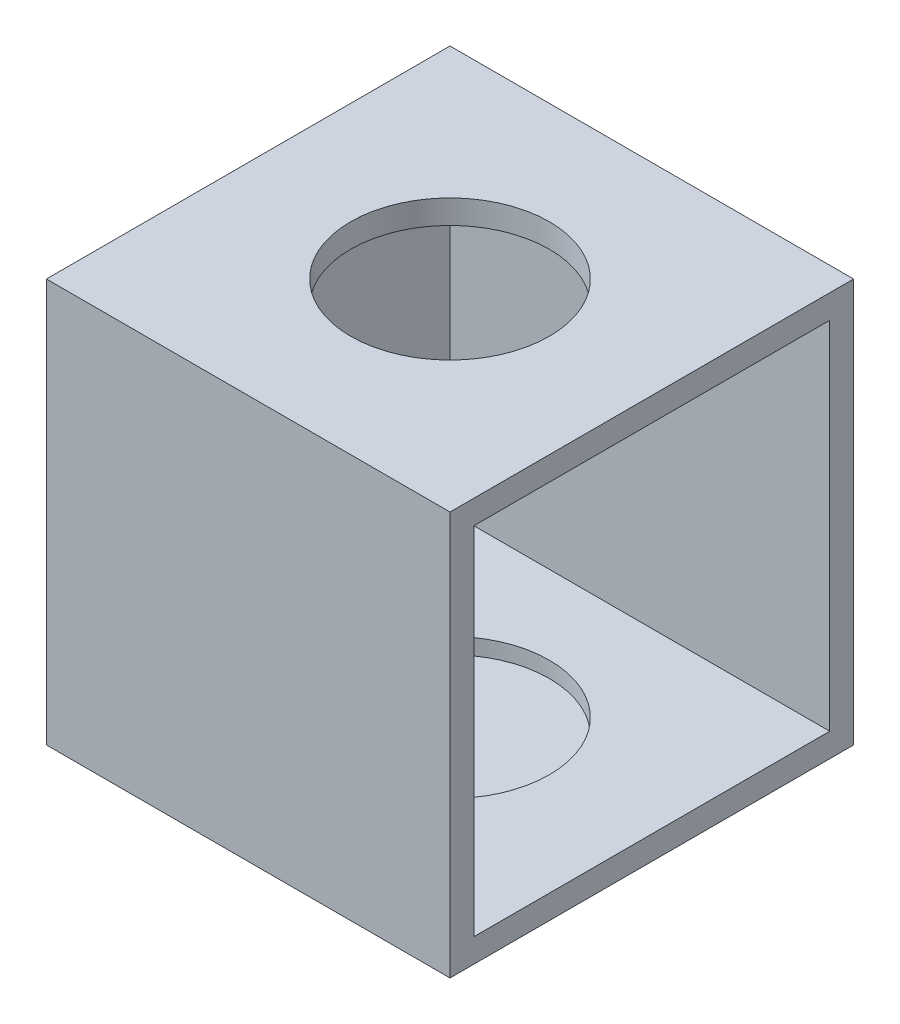
ISO-10303-21;
HEADER;
FILE_DESCRIPTION(('STEP AP214'),'2;1');
FILE_NAME('part.step','',(''),(''),'','','');
FILE_SCHEMA(('AUTOMOTIVE_DESIGN { 1 0 10303 214 1 1 1 1 }'));
ENDSEC;
DATA;
#1=APPLICATION_CONTEXT('core data for automotive mechanical design processes');
#2=APPLICATION_PROTOCOL_DEFINITION('international standard','automotive_design',2000,#1);
#3=PRODUCT_CONTEXT('',#1,'mechanical');
#4=PRODUCT('Part','Part','',(#3));
#5=PRODUCT_RELATED_PRODUCT_CATEGORY('part','',(#4));
#6=PRODUCT_DEFINITION_FORMATION('','',#4);
#7=PRODUCT_DEFINITION_CONTEXT('part definition',#1,'design');
#8=PRODUCT_DEFINITION('design','',#6,#7);
#9=PRODUCT_DEFINITION_SHAPE('','',#8);
#10=(LENGTH_UNIT() NAMED_UNIT(*) SI_UNIT(.MILLI.,.METRE.));
#11=(NAMED_UNIT(*) PLANE_ANGLE_UNIT() SI_UNIT($,.RADIAN.));
#12=(NAMED_UNIT(*) SI_UNIT($,.STERADIAN.) SOLID_ANGLE_UNIT());
#13=UNCERTAINTY_MEASURE_WITH_UNIT(LENGTH_MEASURE(1.E-05),#10,'distance_accuracy_value','');
#14=(GEOMETRIC_REPRESENTATION_CONTEXT(3) GLOBAL_UNCERTAINTY_ASSIGNED_CONTEXT((#13)) GLOBAL_UNIT_ASSIGNED_CONTEXT((#10,
#11,#12)) REPRESENTATION_CONTEXT('',''));
#15=CARTESIAN_POINT('',(0.,0.,0.));
#16=DIRECTION('',(0.,0.,1.));
#17=DIRECTION('',(1.,0.,0.));
#18=AXIS2_PLACEMENT_3D('',#15,#16,#17);
#19=CARTESIAN_POINT('',(25.4,50.8,-25.4));
#20=DIRECTION('',(-1.,0.,0.));
#21=DIRECTION('',(0.,0.,1.));
#22=AXIS2_PLACEMENT_3D('',#19,#20,#21);
#23=PLANE('',#22);
#24=DIRECTION('',(0.,0.,-1.));
#25=VECTOR('',#24,1.);
#26=CARTESIAN_POINT('',(25.4,0.,-25.4));
#27=LINE('',#26,#25);
#28=CARTESIAN_POINT('',(25.4,0.,25.4));
#29=VERTEX_POINT('',#28);
#30=CARTESIAN_POINT('',(25.4,0.,-25.4));
#31=VERTEX_POINT('',#30);
#32=EDGE_CURVE('E229',#29,#31,#27,.T.);
#33=ORIENTED_EDGE('',*,*,#32,.T.);
#34=DIRECTION('',(0.,-1.,0.));
#35=VECTOR('',#34,1.);
#36=CARTESIAN_POINT('',(25.4,50.8,-25.4));
#37=LINE('',#36,#35);
#38=CARTESIAN_POINT('',(25.4,50.8,-25.4));
#39=VERTEX_POINT('',#38);
#40=EDGE_CURVE('E11',#39,#31,#37,.T.);
#41=ORIENTED_EDGE('',*,*,#40,.F.);
#42=DIRECTION('',(0.,0.,-1.));
#43=VECTOR('',#42,1.);
#44=CARTESIAN_POINT('',(25.4,50.8,-25.4));
#45=LINE('',#44,#43);
#46=CARTESIAN_POINT('',(25.4,50.8,25.4));
#47=VERTEX_POINT('',#46);
#48=EDGE_CURVE('E239',#47,#39,#45,.T.);
#49=ORIENTED_EDGE('',*,*,#48,.F.);
#50=DIRECTION('',(0.,-1.,0.));
#51=VECTOR('',#50,1.);
#52=CARTESIAN_POINT('',(25.4,50.8,25.4));
#53=LINE('',#52,#51);
#54=EDGE_CURVE('E253',#47,#29,#53,.T.);
#55=ORIENTED_EDGE('',*,*,#54,.T.);
#56=EDGE_LOOP('',(#33,#41,#49,#55));
#57=FACE_BOUND('',#56,.T.);
#58=DIRECTION('',(0.,0.,-1.));
#59=VECTOR('',#58,1.);
#60=CARTESIAN_POINT('',(25.4,3.,-25.4));
#61=LINE('',#60,#59);
#62=CARTESIAN_POINT('',(25.4,3.,22.4));
#63=VERTEX_POINT('',#62);
#64=CARTESIAN_POINT('',(25.4,3.,-22.4));
#65=VERTEX_POINT('',#64);
#66=EDGE_CURVE('E199',#63,#65,#61,.T.);
#67=ORIENTED_EDGE('',*,*,#66,.F.);
#68=DIRECTION('',(0.,-1.,0.));
#69=VECTOR('',#68,1.);
#70=CARTESIAN_POINT('',(25.4,50.8,22.4));
#71=LINE('',#70,#69);
#72=CARTESIAN_POINT('',(25.4,47.8,22.4));
#73=VERTEX_POINT('',#72);
#74=EDGE_CURVE('E217',#73,#63,#71,.T.);
#75=ORIENTED_EDGE('',*,*,#74,.F.);
#76=DIRECTION('',(0.,0.,-1.));
#77=VECTOR('',#76,1.);
#78=CARTESIAN_POINT('',(25.4,47.8,-25.4));
#79=LINE('',#78,#77);
#80=CARTESIAN_POINT('',(25.4,47.8,-22.4));
#81=VERTEX_POINT('',#80);
#82=EDGE_CURVE('E210',#73,#81,#79,.T.);
#83=ORIENTED_EDGE('',*,*,#82,.T.);
#84=DIRECTION('',(0.,-1.,0.));
#85=VECTOR('',#84,1.);
#86=CARTESIAN_POINT('',(25.4,50.8,-22.4));
#87=LINE('',#86,#85);
#88=EDGE_CURVE('E204',#81,#65,#87,.T.);
#89=ORIENTED_EDGE('',*,*,#88,.T.);
#90=EDGE_LOOP('',(#67,#75,#83,#89));
#91=FACE_BOUND('',#90,.T.);
#92=ADVANCED_FACE('F39',(#57,#91),#23,.F.);
#93=CARTESIAN_POINT('',(-25.4,50.8,-25.4));
#94=DIRECTION('',(0.,0.,1.));
#95=DIRECTION('',(1.,0.,0.));
#96=AXIS2_PLACEMENT_3D('',#93,#94,#95);
#97=PLANE('',#96);
#98=DIRECTION('',(-1.,0.,0.));
#99=VECTOR('',#98,1.);
#100=CARTESIAN_POINT('',(-25.4,0.,-25.4));
#101=LINE('',#100,#99);
#102=CARTESIAN_POINT('',(-25.4,0.,-25.4));
#103=VERTEX_POINT('',#102);
#104=EDGE_CURVE('E257',#31,#103,#101,.T.);
#105=ORIENTED_EDGE('',*,*,#104,.T.);
#106=DIRECTION('',(0.,-1.,0.));
#107=VECTOR('',#106,1.);
#108=CARTESIAN_POINT('',(-25.4,50.8,-25.4));
#109=LINE('',#108,#107);
#110=CARTESIAN_POINT('',(-25.4,50.8,-25.4));
#111=VERTEX_POINT('',#110);
#112=EDGE_CURVE('E48',#111,#103,#109,.T.);
#113=ORIENTED_EDGE('',*,*,#112,.F.);
#114=DIRECTION('',(-1.,0.,0.));
#115=VECTOR('',#114,1.);
#116=CARTESIAN_POINT('',(-25.4,50.8,-25.4));
#117=LINE('',#116,#115);
#118=EDGE_CURVE('E243',#39,#111,#117,.T.);
#119=ORIENTED_EDGE('',*,*,#118,.F.);
#120=ORIENTED_EDGE('',*,*,#40,.T.);
#121=EDGE_LOOP('',(#105,#113,#119,#120));
#122=FACE_BOUND('',#121,.T.);
#123=ADVANCED_FACE('F302',(#122),#97,.F.);
#124=CARTESIAN_POINT('',(-25.4,50.8,-25.4));
#125=DIRECTION('',(1.,0.,0.));
#126=DIRECTION('',(0.,0.,-1.));
#127=AXIS2_PLACEMENT_3D('',#124,#125,#126);
#128=PLANE('',#127);
#129=DIRECTION('',(0.,0.,-1.));
#130=VECTOR('',#129,1.);
#131=CARTESIAN_POINT('',(-25.4,40.442725035698,-25.4));
#132=LINE('',#131,#130);
#133=CARTESIAN_POINT('',(-25.4,40.442725035698,12.5));
#134=VERTEX_POINT('',#133);
#135=CARTESIAN_POINT('',(-25.4,40.442725035698,-12.5));
#136=VERTEX_POINT('',#135);
#137=EDGE_CURVE('E170',#134,#136,#132,.T.);
#138=ORIENTED_EDGE('',*,*,#137,.T.);
#139=DIRECTION('',(0.,1.,0.));
#140=VECTOR('',#139,1.);
#141=CARTESIAN_POINT('',(-25.4,50.8,-12.5));
#142=LINE('',#141,#140);
#143=CARTESIAN_POINT('',(-25.4,46.442725035698,-12.5));
#144=VERTEX_POINT('',#143);
#145=EDGE_CURVE('E174',#136,#144,#142,.T.);
#146=ORIENTED_EDGE('',*,*,#145,.T.);
#147=DIRECTION('',(0.,0.,1.));
#148=VECTOR('',#147,1.);
#149=CARTESIAN_POINT('',(-25.4,46.442725035698,-25.4));
#150=LINE('',#149,#148);
#151=CARTESIAN_POINT('',(-25.4,46.442725035698,12.5));
#152=VERTEX_POINT('',#151);
#153=EDGE_CURVE('E161',#144,#152,#150,.T.);
#154=ORIENTED_EDGE('',*,*,#153,.T.);
#155=DIRECTION('',(0.,-1.,0.));
#156=VECTOR('',#155,1.);
#157=CARTESIAN_POINT('',(-25.4,50.8,12.5));
#158=LINE('',#157,#156);
#159=EDGE_CURVE('E136',#152,#134,#158,.T.);
#160=ORIENTED_EDGE('',*,*,#159,.T.);
#161=EDGE_LOOP('',(#138,#146,#154,#160));
#162=FACE_BOUND('',#161,.T.);
#163=CARTESIAN_POINT('',(-25.4,25.4,0.));
#164=DIRECTION('',(-1.,0.,0.));
#165=DIRECTION('',(0.,0.,1.));
#166=AXIS2_PLACEMENT_3D('',#163,#164,#165);
#167=CIRCLE('',#166,3.175);
#168=CARTESIAN_POINT('',(-25.4,25.4,3.175));
#169=VERTEX_POINT('',#168);
#170=EDGE_CURVE('E190',#169,#169,#167,.T.);
#171=ORIENTED_EDGE('',*,*,#170,.F.);
#172=EDGE_LOOP('',(#171));
#173=FACE_BOUND('',#172,.T.);
#174=DIRECTION('',(0.,0.,1.));
#175=VECTOR('',#174,1.);
#176=CARTESIAN_POINT('',(-25.4,0.,-25.4));
#177=LINE('',#176,#175);
#178=CARTESIAN_POINT('',(-25.4,0.,25.4));
#179=VERTEX_POINT('',#178);
#180=EDGE_CURVE('E260',#103,#179,#177,.T.);
#181=ORIENTED_EDGE('',*,*,#180,.T.);
#182=DIRECTION('',(0.,-1.,0.));
#183=VECTOR('',#182,1.);
#184=CARTESIAN_POINT('',(-25.4,50.8,25.4));
#185=LINE('',#184,#183);
#186=CARTESIAN_POINT('',(-25.4,50.8,25.4));
#187=VERTEX_POINT('',#186);
#188=EDGE_CURVE('E268',#187,#179,#185,.T.);
#189=ORIENTED_EDGE('',*,*,#188,.F.);
#190=DIRECTION('',(0.,0.,1.));
#191=VECTOR('',#190,1.);
#192=CARTESIAN_POINT('',(-25.4,50.8,-25.4));
#193=LINE('',#192,#191);
#194=EDGE_CURVE('E247',#111,#187,#193,.T.);
#195=ORIENTED_EDGE('',*,*,#194,.F.);
#196=ORIENTED_EDGE('',*,*,#112,.T.);
#197=EDGE_LOOP('',(#181,#189,#195,#196));
#198=FACE_BOUND('',#197,.T.);
#199=ADVANCED_FACE('F307',(#162,#173,#198),#128,.F.);
#200=CARTESIAN_POINT('',(-25.4,50.8,25.4));
#201=DIRECTION('',(0.,0.,-1.));
#202=DIRECTION('',(-1.,0.,0.));
#203=AXIS2_PLACEMENT_3D('',#200,#201,#202);
#204=PLANE('',#203);
#205=DIRECTION('',(1.,0.,0.));
#206=VECTOR('',#205,1.);
#207=CARTESIAN_POINT('',(-25.4,0.,25.4));
#208=LINE('',#207,#206);
#209=EDGE_CURVE('E244',#179,#29,#208,.T.);
#210=ORIENTED_EDGE('',*,*,#209,.T.);
#211=ORIENTED_EDGE('',*,*,#54,.F.);
#212=DIRECTION('',(1.,0.,0.));
#213=VECTOR('',#212,1.);
#214=CARTESIAN_POINT('',(-25.4,50.8,25.4));
#215=LINE('',#214,#213);
#216=EDGE_CURVE('E250',#187,#47,#215,.T.);
#217=ORIENTED_EDGE('',*,*,#216,.F.);
#218=ORIENTED_EDGE('',*,*,#188,.T.);
#219=EDGE_LOOP('',(#210,#211,#217,#218));
#220=FACE_BOUND('',#219,.T.);
#221=ADVANCED_FACE('F324',(#220),#204,.F.);
#222=CARTESIAN_POINT('',(0.,50.8,0.));
#223=DIRECTION('',(0.,1.,0.));
#224=DIRECTION('',(0.,0.,1.));
#225=AXIS2_PLACEMENT_3D('',#222,#223,#224);
#226=PLANE('',#225);
#227=CARTESIAN_POINT('',(0.,50.8,0.));
#228=DIRECTION('',(0.,1.,0.));
#229=DIRECTION('',(0.,0.,1.));
#230=AXIS2_PLACEMENT_3D('',#227,#228,#229);
#231=CIRCLE('',#230,12.5);
#232=CARTESIAN_POINT('',(0.,50.8,12.5));
#233=VERTEX_POINT('',#232);
#234=EDGE_CURVE('E178',#233,#233,#231,.T.);
#235=ORIENTED_EDGE('',*,*,#234,.F.);
#236=EDGE_LOOP('',(#235));
#237=FACE_BOUND('',#236,.T.);
#238=ORIENTED_EDGE('',*,*,#48,.T.);
#239=ORIENTED_EDGE('',*,*,#118,.T.);
#240=ORIENTED_EDGE('',*,*,#194,.T.);
#241=ORIENTED_EDGE('',*,*,#216,.T.);
#242=EDGE_LOOP('',(#238,#239,#240,#241));
#243=FACE_BOUND('',#242,.T.);
#244=ADVANCED_FACE('F320',(#237,#243),#226,.T.);
#245=CARTESIAN_POINT('',(0.,0.,0.));
#246=DIRECTION('',(0.,1.,0.));
#247=DIRECTION('',(0.,0.,1.));
#248=AXIS2_PLACEMENT_3D('',#245,#246,#247);
#249=PLANE('',#248);
#250=ORIENTED_EDGE('',*,*,#32,.F.);
#251=ORIENTED_EDGE('',*,*,#209,.F.);
#252=ORIENTED_EDGE('',*,*,#180,.F.);
#253=ORIENTED_EDGE('',*,*,#104,.F.);
#254=EDGE_LOOP('',(#250,#251,#252,#253));
#255=FACE_BOUND('',#254,.T.);
#256=ADVANCED_FACE('F315',(#255),#249,.F.);
#257=CARTESIAN_POINT('',(-25.4,50.8,-22.4));
#258=DIRECTION('',(0.,0.,1.));
#259=DIRECTION('',(1.,0.,0.));
#260=AXIS2_PLACEMENT_3D('',#257,#258,#259);
#261=PLANE('',#260);
#262=DIRECTION('',(-1.,0.,0.));
#263=VECTOR('',#262,1.);
#264=CARTESIAN_POINT('',(-25.4,3.,-22.4));
#265=LINE('',#264,#263);
#266=CARTESIAN_POINT('',(-22.4,3.,-22.4));
#267=VERTEX_POINT('',#266);
#268=EDGE_CURVE('E195',#65,#267,#265,.T.);
#269=ORIENTED_EDGE('',*,*,#268,.F.);
#270=ORIENTED_EDGE('',*,*,#88,.F.);
#271=DIRECTION('',(-1.,0.,0.));
#272=VECTOR('',#271,1.);
#273=CARTESIAN_POINT('',(-25.4,47.8,-22.4));
#274=LINE('',#273,#272);
#275=CARTESIAN_POINT('',(-22.4,47.8,-22.4));
#276=VERTEX_POINT('',#275);
#277=EDGE_CURVE('E206',#81,#276,#274,.T.);
#278=ORIENTED_EDGE('',*,*,#277,.T.);
#279=DIRECTION('',(0.,-1.,0.));
#280=VECTOR('',#279,1.);
#281=CARTESIAN_POINT('',(-22.4,50.8,-22.4));
#282=LINE('',#281,#280);
#283=EDGE_CURVE('E200',#276,#267,#282,.T.);
#284=ORIENTED_EDGE('',*,*,#283,.T.);
#285=EDGE_LOOP('',(#269,#270,#278,#284));
#286=FACE_BOUND('',#285,.T.);
#287=ADVANCED_FACE('F283',(#286),#261,.T.);
#288=CARTESIAN_POINT('',(-22.4,50.8,-25.4));
#289=DIRECTION('',(1.,0.,0.));
#290=DIRECTION('',(0.,0.,-1.));
#291=AXIS2_PLACEMENT_3D('',#288,#289,#290);
#292=PLANE('',#291);
#293=DIRECTION('',(0.,1.,0.));
#294=VECTOR('',#293,1.);
#295=CARTESIAN_POINT('',(-22.4,46.442725035698,-12.5));
#296=LINE('',#295,#294);
#297=CARTESIAN_POINT('',(-22.4,40.442725035698,-12.5));
#298=VERTEX_POINT('',#297);
#299=CARTESIAN_POINT('',(-22.4,46.442725035698,-12.5));
#300=VERTEX_POINT('',#299);
#301=EDGE_CURVE('E64',#298,#300,#296,.T.);
#302=ORIENTED_EDGE('',*,*,#301,.F.);
#303=DIRECTION('',(0.,0.,-1.));
#304=VECTOR('',#303,1.);
#305=CARTESIAN_POINT('',(-22.4,40.442725035698,12.5));
#306=LINE('',#305,#304);
#307=CARTESIAN_POINT('',(-22.4,40.442725035698,12.5));
#308=VERTEX_POINT('',#307);
#309=EDGE_CURVE('E151',#308,#298,#306,.T.);
#310=ORIENTED_EDGE('',*,*,#309,.F.);
#311=DIRECTION('',(0.,-1.,0.));
#312=VECTOR('',#311,1.);
#313=CARTESIAN_POINT('',(-22.4,46.442725035698,12.5));
#314=LINE('',#313,#312);
#315=CARTESIAN_POINT('',(-22.4,46.442725035698,12.5));
#316=VERTEX_POINT('',#315);
#317=EDGE_CURVE('E133',#316,#308,#314,.T.);
#318=ORIENTED_EDGE('',*,*,#317,.F.);
#319=DIRECTION('',(0.,0.,1.));
#320=VECTOR('',#319,1.);
#321=CARTESIAN_POINT('',(-22.4,46.442725035698,12.5));
#322=LINE('',#321,#320);
#323=EDGE_CURVE('E143',#300,#316,#322,.T.);
#324=ORIENTED_EDGE('',*,*,#323,.F.);
#325=EDGE_LOOP('',(#302,#310,#318,#324));
#326=FACE_BOUND('',#325,.T.);
#327=CARTESIAN_POINT('',(-22.4,25.4,0.));
#328=DIRECTION('',(1.,0.,0.));
#329=DIRECTION('',(0.,0.,-1.));
#330=AXIS2_PLACEMENT_3D('',#327,#328,#329);
#331=CIRCLE('',#330,3.175);
#332=CARTESIAN_POINT('',(-22.4,25.4,-3.175));
#333=VERTEX_POINT('',#332);
#334=EDGE_CURVE('E194',#333,#333,#331,.T.);
#335=ORIENTED_EDGE('',*,*,#334,.F.);
#336=EDGE_LOOP('',(#335));
#337=FACE_BOUND('',#336,.T.);
#338=DIRECTION('',(0.,0.,1.));
#339=VECTOR('',#338,1.);
#340=CARTESIAN_POINT('',(-22.4,3.,-25.4));
#341=LINE('',#340,#339);
#342=CARTESIAN_POINT('',(-22.4,3.,22.4));
#343=VERTEX_POINT('',#342);
#344=EDGE_CURVE('E198',#267,#343,#341,.T.);
#345=ORIENTED_EDGE('',*,*,#344,.F.);
#346=ORIENTED_EDGE('',*,*,#283,.F.);
#347=DIRECTION('',(0.,0.,1.));
#348=VECTOR('',#347,1.);
#349=CARTESIAN_POINT('',(-22.4,47.8,-25.4));
#350=LINE('',#349,#348);
#351=CARTESIAN_POINT('',(-22.4,47.8,22.4));
#352=VERTEX_POINT('',#351);
#353=EDGE_CURVE('E209',#276,#352,#350,.T.);
#354=ORIENTED_EDGE('',*,*,#353,.T.);
#355=DIRECTION('',(0.,-1.,0.));
#356=VECTOR('',#355,1.);
#357=CARTESIAN_POINT('',(-22.4,50.8,22.4));
#358=LINE('',#357,#356);
#359=EDGE_CURVE('E205',#352,#343,#358,.T.);
#360=ORIENTED_EDGE('',*,*,#359,.T.);
#361=EDGE_LOOP('',(#345,#346,#354,#360));
#362=FACE_BOUND('',#361,.T.);
#363=ADVANCED_FACE('F148',(#326,#337,#362),#292,.T.);
#364=CARTESIAN_POINT('',(-25.4,50.8,22.4));
#365=DIRECTION('',(0.,0.,-1.));
#366=DIRECTION('',(-1.,0.,0.));
#367=AXIS2_PLACEMENT_3D('',#364,#365,#366);
#368=PLANE('',#367);
#369=DIRECTION('',(1.,0.,0.));
#370=VECTOR('',#369,1.);
#371=CARTESIAN_POINT('',(-25.4,3.,22.4));
#372=LINE('',#371,#370);
#373=EDGE_CURVE('E213',#343,#63,#372,.T.);
#374=ORIENTED_EDGE('',*,*,#373,.F.);
#375=ORIENTED_EDGE('',*,*,#359,.F.);
#376=DIRECTION('',(1.,0.,0.));
#377=VECTOR('',#376,1.);
#378=CARTESIAN_POINT('',(-25.4,47.8,22.4));
#379=LINE('',#378,#377);
#380=EDGE_CURVE('E220',#352,#73,#379,.T.);
#381=ORIENTED_EDGE('',*,*,#380,.T.);
#382=ORIENTED_EDGE('',*,*,#74,.T.);
#383=EDGE_LOOP('',(#374,#375,#381,#382));
#384=FACE_BOUND('',#383,.T.);
#385=ADVANCED_FACE('F282',(#384),#368,.T.);
#386=CARTESIAN_POINT('',(0.,47.8,0.));
#387=DIRECTION('',(0.,1.,0.));
#388=DIRECTION('',(0.,0.,1.));
#389=AXIS2_PLACEMENT_3D('',#386,#387,#388);
#390=PLANE('',#389);
#391=CARTESIAN_POINT('',(0.,47.8,0.));
#392=DIRECTION('',(0.,1.,0.));
#393=DIRECTION('',(0.,0.,1.));
#394=AXIS2_PLACEMENT_3D('',#391,#392,#393);
#395=CIRCLE('',#394,12.5);
#396=CARTESIAN_POINT('',(0.,47.8,12.5));
#397=VERTEX_POINT('',#396);
#398=EDGE_CURVE('E186',#397,#397,#395,.T.);
#399=ORIENTED_EDGE('',*,*,#398,.T.);
#400=EDGE_LOOP('',(#399));
#401=FACE_BOUND('',#400,.T.);
#402=ORIENTED_EDGE('',*,*,#82,.F.);
#403=ORIENTED_EDGE('',*,*,#380,.F.);
#404=ORIENTED_EDGE('',*,*,#353,.F.);
#405=ORIENTED_EDGE('',*,*,#277,.F.);
#406=EDGE_LOOP('',(#402,#403,#404,#405));
#407=FACE_BOUND('',#406,.T.);
#408=ADVANCED_FACE('F296',(#401,#407),#390,.F.);
#409=CARTESIAN_POINT('',(0.,3.,0.));
#410=DIRECTION('',(0.,1.,0.));
#411=DIRECTION('',(0.,0.,1.));
#412=AXIS2_PLACEMENT_3D('',#409,#410,#411);
#413=PLANE('',#412);
#414=CARTESIAN_POINT('',(0.,3.,0.));
#415=DIRECTION('',(0.,1.,0.));
#416=DIRECTION('',(0.,0.,1.));
#417=AXIS2_PLACEMENT_3D('',#414,#415,#416);
#418=CIRCLE('',#417,12.5);
#419=CARTESIAN_POINT('',(0.,3.,12.5));
#420=VERTEX_POINT('',#419);
#421=EDGE_CURVE('E42',#420,#420,#418,.T.);
#422=ORIENTED_EDGE('',*,*,#421,.F.);
#423=EDGE_LOOP('',(#422));
#424=FACE_BOUND('',#423,.T.);
#425=ORIENTED_EDGE('',*,*,#66,.T.);
#426=ORIENTED_EDGE('',*,*,#268,.T.);
#427=ORIENTED_EDGE('',*,*,#344,.T.);
#428=ORIENTED_EDGE('',*,*,#373,.T.);
#429=EDGE_LOOP('',(#425,#426,#427,#428));
#430=FACE_BOUND('',#429,.T.);
#431=ADVANCED_FACE('F291',(#424,#430),#413,.T.);
#432=CARTESIAN_POINT('',(25.4,25.4,0.));
#433=DIRECTION('',(-1.,0.,0.));
#434=DIRECTION('',(0.,0.,1.));
#435=AXIS2_PLACEMENT_3D('',#432,#433,#434);
#436=CYLINDRICAL_SURFACE('',#435,3.175);
#437=ORIENTED_EDGE('',*,*,#334,.T.);
#438=EDGE_LOOP('',(#437));
#439=FACE_BOUND('',#438,.T.);
#440=ORIENTED_EDGE('',*,*,#170,.T.);
#441=EDGE_LOOP('',(#440));
#442=FACE_BOUND('',#441,.T.);
#443=ADVANCED_FACE('F278',(#439,#442),#436,.F.);
#444=CARTESIAN_POINT('',(0.,1.,0.));
#445=DIRECTION('',(0.,1.,0.));
#446=DIRECTION('',(0.,0.,1.));
#447=AXIS2_PLACEMENT_3D('',#444,#445,#446);
#448=PLANE('',#447);
#449=CARTESIAN_POINT('',(0.,1.,0.));
#450=DIRECTION('',(0.,1.,0.));
#451=DIRECTION('',(0.,0.,1.));
#452=AXIS2_PLACEMENT_3D('',#449,#450,#451);
#453=CIRCLE('',#452,12.5);
#454=CARTESIAN_POINT('',(0.,1.,12.5));
#455=VERTEX_POINT('',#454);
#456=EDGE_CURVE('E179',#455,#455,#453,.T.);
#457=ORIENTED_EDGE('',*,*,#456,.T.);
#458=EDGE_LOOP('',(#457));
#459=FACE_BOUND('',#458,.T.);
#460=ADVANCED_FACE('F352',(#459),#448,.T.);
#461=CARTESIAN_POINT('',(0.,1.,0.));
#462=DIRECTION('',(0.,1.,0.));
#463=DIRECTION('',(0.,0.,1.));
#464=AXIS2_PLACEMENT_3D('',#461,#462,#463);
#465=CYLINDRICAL_SURFACE('',#464,12.5);
#466=ORIENTED_EDGE('',*,*,#421,.T.);
#467=EDGE_LOOP('',(#466));
#468=FACE_BOUND('',#467,.T.);
#469=ORIENTED_EDGE('',*,*,#456,.F.);
#470=EDGE_LOOP('',(#469));
#471=FACE_BOUND('',#470,.T.);
#472=ADVANCED_FACE('F353',(#468,#471),#465,.F.);
#473=ORIENTED_EDGE('',*,*,#234,.T.);
#474=EDGE_LOOP('',(#473));
#475=FACE_BOUND('',#474,.T.);
#476=ORIENTED_EDGE('',*,*,#398,.F.);
#477=EDGE_LOOP('',(#476));
#478=FACE_BOUND('',#477,.T.);
#479=ADVANCED_FACE('F356',(#475,#478),#465,.F.);
#480=CARTESIAN_POINT('',(-72.2,46.442725035698,-12.5));
#481=DIRECTION('',(0.,0.,-1.));
#482=DIRECTION('',(-1.,0.,0.));
#483=AXIS2_PLACEMENT_3D('',#480,#481,#482);
#484=PLANE('',#483);
#485=DIRECTION('',(1.,0.,0.));
#486=VECTOR('',#485,1.);
#487=CARTESIAN_POINT('',(-72.2,40.442725035698,-12.5));
#488=LINE('',#487,#486);
#489=EDGE_CURVE('E158',#136,#298,#488,.T.);
#490=ORIENTED_EDGE('',*,*,#489,.T.);
#491=ORIENTED_EDGE('',*,*,#301,.T.);
#492=DIRECTION('',(1.,0.,0.));
#493=VECTOR('',#492,1.);
#494=CARTESIAN_POINT('',(-72.2,46.442725035698,-12.5));
#495=LINE('',#494,#493);
#496=EDGE_CURVE('E140',#144,#300,#495,.T.);
#497=ORIENTED_EDGE('',*,*,#496,.F.);
#498=ORIENTED_EDGE('',*,*,#145,.F.);
#499=EDGE_LOOP('',(#490,#491,#497,#498));
#500=FACE_BOUND('',#499,.T.);
#501=ADVANCED_FACE('F361',(#500),#484,.F.);
#502=CARTESIAN_POINT('',(-72.2,40.442725035698,12.5));
#503=DIRECTION('',(0.,-1.,0.));
#504=DIRECTION('',(0.,0.,-1.));
#505=AXIS2_PLACEMENT_3D('',#502,#503,#504);
#506=PLANE('',#505);
#507=DIRECTION('',(1.,0.,0.));
#508=VECTOR('',#507,1.);
#509=CARTESIAN_POINT('',(-72.2,40.442725035698,12.5));
#510=LINE('',#509,#508);
#511=EDGE_CURVE('E139',#134,#308,#510,.T.);
#512=ORIENTED_EDGE('',*,*,#511,.T.);
#513=ORIENTED_EDGE('',*,*,#309,.T.);
#514=ORIENTED_EDGE('',*,*,#489,.F.);
#515=ORIENTED_EDGE('',*,*,#137,.F.);
#516=EDGE_LOOP('',(#512,#513,#514,#515));
#517=FACE_BOUND('',#516,.T.);
#518=ADVANCED_FACE('F364',(#517),#506,.F.);
#519=CARTESIAN_POINT('',(-72.2,46.442725035698,12.5));
#520=DIRECTION('',(0.,0.,1.));
#521=DIRECTION('',(1.,0.,0.));
#522=AXIS2_PLACEMENT_3D('',#519,#520,#521);
#523=PLANE('',#522);
#524=DIRECTION('',(1.,0.,0.));
#525=VECTOR('',#524,1.);
#526=CARTESIAN_POINT('',(-72.2,46.442725035698,12.5));
#527=LINE('',#526,#525);
#528=EDGE_CURVE('E56',#152,#316,#527,.T.);
#529=ORIENTED_EDGE('',*,*,#528,.T.);
#530=ORIENTED_EDGE('',*,*,#317,.T.);
#531=ORIENTED_EDGE('',*,*,#511,.F.);
#532=ORIENTED_EDGE('',*,*,#159,.F.);
#533=EDGE_LOOP('',(#529,#530,#531,#532));
#534=FACE_BOUND('',#533,.T.);
#535=ADVANCED_FACE('F130',(#534),#523,.F.);
#536=CARTESIAN_POINT('',(-72.2,46.442725035698,12.5));
#537=DIRECTION('',(0.,1.,0.));
#538=DIRECTION('',(0.,0.,1.));
#539=AXIS2_PLACEMENT_3D('',#536,#537,#538);
#540=PLANE('',#539);
#541=ORIENTED_EDGE('',*,*,#496,.T.);
#542=ORIENTED_EDGE('',*,*,#323,.T.);
#543=ORIENTED_EDGE('',*,*,#528,.F.);
#544=ORIENTED_EDGE('',*,*,#153,.F.);
#545=EDGE_LOOP('',(#541,#542,#543,#544));
#546=FACE_BOUND('',#545,.T.);
#547=ADVANCED_FACE('F144',(#546),#540,.F.);
#548=CLOSED_SHELL('',(#92,#123,#199,#221,#244,#256,#287,#363,#385,#408,#431,#443,#460,#472,#479,
#501,#518,#535,#547));
#549=MANIFOLD_SOLID_BREP('B2',#548);
#550=ADVANCED_BREP_SHAPE_REPRESENTATION('',(#18,#549),#14);
#551=SHAPE_DEFINITION_REPRESENTATION(#9,#550);
ENDSEC;
END-ISO-10303-21;
